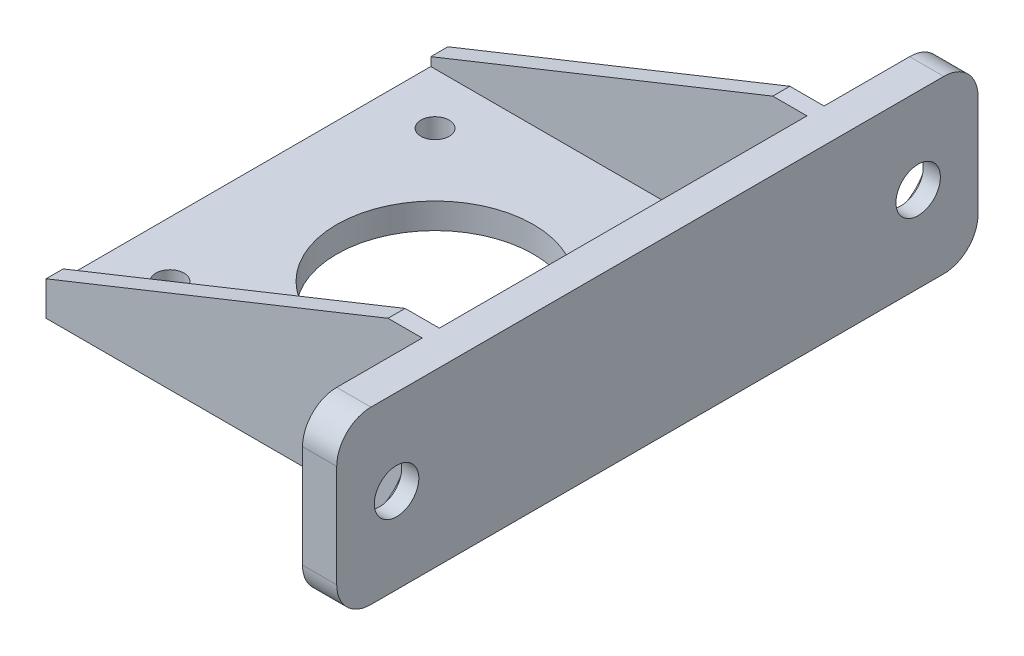
ISO-10303-21;
HEADER;
FILE_DESCRIPTION(('STEP AP214'),'2;1');
FILE_NAME('part.step','',(''),(''),'','','');
FILE_SCHEMA(('AUTOMOTIVE_DESIGN { 1 0 10303 214 1 1 1 1 }'));
ENDSEC;
DATA;
#1=APPLICATION_CONTEXT('core data for automotive mechanical design processes');
#2=APPLICATION_PROTOCOL_DEFINITION('international standard','automotive_design',2000,#1);
#3=PRODUCT_CONTEXT('',#1,'mechanical');
#4=PRODUCT('Part','Part','',(#3));
#5=PRODUCT_RELATED_PRODUCT_CATEGORY('part','',(#4));
#6=PRODUCT_DEFINITION_FORMATION('','',#4);
#7=PRODUCT_DEFINITION_CONTEXT('part definition',#1,'design');
#8=PRODUCT_DEFINITION('design','',#6,#7);
#9=PRODUCT_DEFINITION_SHAPE('','',#8);
#10=(LENGTH_UNIT() NAMED_UNIT(*) SI_UNIT(.MILLI.,.METRE.));
#11=(NAMED_UNIT(*) PLANE_ANGLE_UNIT() SI_UNIT($,.RADIAN.));
#12=(NAMED_UNIT(*) SI_UNIT($,.STERADIAN.) SOLID_ANGLE_UNIT());
#13=UNCERTAINTY_MEASURE_WITH_UNIT(LENGTH_MEASURE(1.E-05),#10,'distance_accuracy_value','');
#14=(GEOMETRIC_REPRESENTATION_CONTEXT(3) GLOBAL_UNCERTAINTY_ASSIGNED_CONTEXT((#13)) GLOBAL_UNIT_ASSIGNED_CONTEXT((#10,
#11,#12)) REPRESENTATION_CONTEXT('',''));
#15=CARTESIAN_POINT('',(0.,0.,0.));
#16=DIRECTION('',(0.,0.,1.));
#17=DIRECTION('',(1.,0.,0.));
#18=AXIS2_PLACEMENT_3D('',#15,#16,#17);
#19=CARTESIAN_POINT('',(-67.498,120.,233.));
#20=DIRECTION('',(-1.,0.,0.));
#21=DIRECTION('',(0.,0.,1.));
#22=AXIS2_PLACEMENT_3D('',#19,#20,#21);
#23=CYLINDRICAL_SURFACE('',#22,2.6);
#24=CARTESIAN_POINT('',(-67.5,120.,233.));
#25=DIRECTION('',(-1.,0.,0.));
#26=DIRECTION('',(0.,0.,1.));
#27=AXIS2_PLACEMENT_3D('',#24,#25,#26);
#28=CIRCLE('',#27,2.6);
#29=CARTESIAN_POINT('',(-67.5,120.,235.6));
#30=VERTEX_POINT('',#29);
#31=EDGE_CURVE('E219',#30,#30,#28,.F.);
#32=ORIENTED_EDGE('',*,*,#31,.T.);
#33=EDGE_LOOP('',(#32));
#34=FACE_BOUND('',#33,.T.);
#35=CARTESIAN_POINT('',(-69.5,120.,233.));
#36=DIRECTION('',(-1.,0.,0.));
#37=DIRECTION('',(0.,0.,1.));
#38=AXIS2_PLACEMENT_3D('',#35,#36,#37);
#39=CIRCLE('',#38,2.6);
#40=CARTESIAN_POINT('',(-69.5,120.,235.6));
#41=VERTEX_POINT('',#40);
#42=EDGE_CURVE('E587',#41,#41,#39,.T.);
#43=ORIENTED_EDGE('',*,*,#42,.T.);
#44=EDGE_LOOP('',(#43));
#45=FACE_BOUND('',#44,.T.);
#46=ADVANCED_FACE('F16',(#34,#45),#23,.F.);
#47=CARTESIAN_POINT('',(-67.498,120.,294.));
#48=DIRECTION('',(-1.,0.,0.));
#49=DIRECTION('',(0.,0.,1.));
#50=AXIS2_PLACEMENT_3D('',#47,#48,#49);
#51=CYLINDRICAL_SURFACE('',#50,2.6);
#52=CARTESIAN_POINT('',(-67.5,120.,294.));
#53=DIRECTION('',(-1.,0.,0.));
#54=DIRECTION('',(0.,0.,1.));
#55=AXIS2_PLACEMENT_3D('',#52,#53,#54);
#56=CIRCLE('',#55,2.6);
#57=CARTESIAN_POINT('',(-67.5,120.,296.6));
#58=VERTEX_POINT('',#57);
#59=EDGE_CURVE('E212',#58,#58,#56,.F.);
#60=ORIENTED_EDGE('',*,*,#59,.T.);
#61=EDGE_LOOP('',(#60));
#62=FACE_BOUND('',#61,.T.);
#63=CARTESIAN_POINT('',(-69.5,120.,294.));
#64=DIRECTION('',(-1.,0.,0.));
#65=DIRECTION('',(0.,0.,1.));
#66=AXIS2_PLACEMENT_3D('',#63,#64,#65);
#67=CIRCLE('',#66,2.6);
#68=CARTESIAN_POINT('',(-69.5,120.,296.6));
#69=VERTEX_POINT('',#68);
#70=EDGE_CURVE('E572',#69,#69,#67,.T.);
#71=ORIENTED_EDGE('',*,*,#70,.T.);
#72=EDGE_LOOP('',(#71));
#73=FACE_BOUND('',#72,.T.);
#74=ADVANCED_FACE('F485',(#62,#73),#51,.F.);
#75=CARTESIAN_POINT('',(-71.5,120.,170.));
#76=DIRECTION('',(-1.,0.,0.));
#77=DIRECTION('',(0.,-1.,0.));
#78=AXIS2_PLACEMENT_3D('',#75,#76,#77);
#79=PLANE('',#78);
#80=DIRECTION('',(0.,0.,-1.));
#81=VECTOR('',#80,1.);
#82=CARTESIAN_POINT('',(-71.5,130.,320.));
#83=LINE('',#82,#81);
#84=CARTESIAN_POINT('',(-71.5,130.,285.));
#85=VERTEX_POINT('',#84);
#86=CARTESIAN_POINT('',(-71.5,130.,242.));
#87=VERTEX_POINT('',#86);
#88=EDGE_CURVE('E202',#85,#87,#83,.T.);
#89=ORIENTED_EDGE('',*,*,#88,.T.);
#90=DIRECTION('',(0.,-1.,0.));
#91=VECTOR('',#90,1.);
#92=CARTESIAN_POINT('',(-71.5,130.002,242.));
#93=LINE('',#92,#91);
#94=CARTESIAN_POINT('',(-71.5,113.,242.));
#95=VERTEX_POINT('',#94);
#96=EDGE_CURVE('E199',#87,#95,#93,.T.);
#97=ORIENTED_EDGE('',*,*,#96,.T.);
#98=DIRECTION('',(0.,0.,-1.));
#99=VECTOR('',#98,1.);
#100=CARTESIAN_POINT('',(-71.5,113.,320.));
#101=LINE('',#100,#99);
#102=CARTESIAN_POINT('',(-71.5,113.,285.));
#103=VERTEX_POINT('',#102);
#104=EDGE_CURVE('E183',#103,#95,#101,.T.);
#105=ORIENTED_EDGE('',*,*,#104,.F.);
#106=DIRECTION('',(0.,-1.,0.));
#107=VECTOR('',#106,1.);
#108=CARTESIAN_POINT('',(-71.5,130.002,285.));
#109=LINE('',#108,#107);
#110=EDGE_CURVE('E232',#85,#103,#109,.T.);
#111=ORIENTED_EDGE('',*,*,#110,.F.);
#112=EDGE_LOOP('',(#89,#97,#105,#111));
#113=FACE_BOUND('',#112,.T.);
#114=ADVANCED_FACE('F200',(#113),#79,.T.);
#115=CARTESIAN_POINT('',(-91.5,113.,263.5));
#116=DIRECTION('',(0.,-1.,0.));
#117=DIRECTION('',(1.,0.,0.));
#118=AXIS2_PLACEMENT_3D('',#115,#116,#117);
#119=PLANE('',#118);
#120=CARTESIAN_POINT('',(-93.5,113.,263.5));
#121=DIRECTION('',(0.,-1.,0.));
#122=DIRECTION('',(0.,0.,-1.));
#123=AXIS2_PLACEMENT_3D('',#120,#121,#122);
#124=CIRCLE('',#123,11.5);
#125=CARTESIAN_POINT('',(-93.5,113.,252.));
#126=VERTEX_POINT('',#125);
#127=EDGE_CURVE('E251',#126,#126,#124,.F.);
#128=ORIENTED_EDGE('',*,*,#127,.F.);
#129=EDGE_LOOP('',(#128));
#130=FACE_BOUND('',#129,.T.);
#131=CARTESIAN_POINT('',(-109.,113.,279.));
#132=DIRECTION('',(0.,-1.,0.));
#133=DIRECTION('',(0.,0.,-1.));
#134=AXIS2_PLACEMENT_3D('',#131,#132,#133);
#135=CIRCLE('',#134,1.65);
#136=CARTESIAN_POINT('',(-109.,113.,277.35));
#137=VERTEX_POINT('',#136);
#138=EDGE_CURVE('E252',#137,#137,#135,.F.);
#139=ORIENTED_EDGE('',*,*,#138,.F.);
#140=EDGE_LOOP('',(#139));
#141=FACE_BOUND('',#140,.T.);
#142=CARTESIAN_POINT('',(-78.,113.,279.));
#143=DIRECTION('',(0.,-1.,0.));
#144=DIRECTION('',(0.,0.,-1.));
#145=AXIS2_PLACEMENT_3D('',#142,#143,#144);
#146=CIRCLE('',#145,1.65);
#147=CARTESIAN_POINT('',(-78.,113.,277.35));
#148=VERTEX_POINT('',#147);
#149=EDGE_CURVE('E260',#148,#148,#146,.F.);
#150=ORIENTED_EDGE('',*,*,#149,.F.);
#151=EDGE_LOOP('',(#150));
#152=FACE_BOUND('',#151,.T.);
#153=CARTESIAN_POINT('',(-78.,113.,248.));
#154=DIRECTION('',(0.,-1.,0.));
#155=DIRECTION('',(0.,0.,-1.));
#156=AXIS2_PLACEMENT_3D('',#153,#154,#155);
#157=CIRCLE('',#156,1.65);
#158=CARTESIAN_POINT('',(-78.,113.,246.35));
#159=VERTEX_POINT('',#158);
#160=EDGE_CURVE('E268',#159,#159,#157,.F.);
#161=ORIENTED_EDGE('',*,*,#160,.F.);
#162=EDGE_LOOP('',(#161));
#163=FACE_BOUND('',#162,.T.);
#164=CARTESIAN_POINT('',(-109.,113.,248.));
#165=DIRECTION('',(0.,-1.,0.));
#166=DIRECTION('',(0.,0.,-1.));
#167=AXIS2_PLACEMENT_3D('',#164,#165,#166);
#168=CIRCLE('',#167,1.65);
#169=CARTESIAN_POINT('',(-109.,113.,246.35));
#170=VERTEX_POINT('',#169);
#171=EDGE_CURVE('E243',#170,#170,#168,.F.);
#172=ORIENTED_EDGE('',*,*,#171,.F.);
#173=EDGE_LOOP('',(#172));
#174=FACE_BOUND('',#173,.T.);
#175=DIRECTION('',(1.,0.,0.));
#176=VECTOR('',#175,1.);
#177=CARTESIAN_POINT('',(-93.5,113.,242.));
#178=LINE('',#177,#176);
#179=CARTESIAN_POINT('',(-115.5,113.,242.));
#180=VERTEX_POINT('',#179);
#181=EDGE_CURVE('E188',#180,#95,#178,.T.);
#182=ORIENTED_EDGE('',*,*,#181,.F.);
#183=DIRECTION('',(0.,0.,-1.));
#184=VECTOR('',#183,1.);
#185=CARTESIAN_POINT('',(-115.5,113.,263.5));
#186=LINE('',#185,#184);
#187=CARTESIAN_POINT('',(-115.5,113.,285.));
#188=VERTEX_POINT('',#187);
#189=EDGE_CURVE('E195',#188,#180,#186,.T.);
#190=ORIENTED_EDGE('',*,*,#189,.F.);
#191=DIRECTION('',(1.,0.,0.));
#192=VECTOR('',#191,1.);
#193=CARTESIAN_POINT('',(-93.5,113.,285.));
#194=LINE('',#193,#192);
#195=EDGE_CURVE('E191',#188,#103,#194,.T.);
#196=ORIENTED_EDGE('',*,*,#195,.T.);
#197=ORIENTED_EDGE('',*,*,#104,.T.);
#198=EDGE_LOOP('',(#182,#190,#196,#197));
#199=FACE_BOUND('',#198,.T.);
#200=ADVANCED_FACE('F185',(#130,#141,#152,#163,#174,#199),#119,.F.);
#201=CARTESIAN_POINT('',(-71.5,120.,294.));
#202=DIRECTION('',(-1.,0.,0.));
#203=DIRECTION('',(0.,0.,1.));
#204=AXIS2_PLACEMENT_3D('',#201,#202,#203);
#205=CIRCLE('',#204,5.25);
#206=CARTESIAN_POINT('',(-71.5,120.,299.25));
#207=VERTEX_POINT('',#206);
#208=EDGE_CURVE('E568',#207,#207,#205,.T.);
#209=ORIENTED_EDGE('',*,*,#208,.F.);
#210=EDGE_LOOP('',(#209));
#211=FACE_BOUND('',#210,.T.);
#212=DIRECTION('',(0.,-1.,0.));
#213=VECTOR('',#212,1.);
#214=CARTESIAN_POINT('',(-71.5,120.,301.));
#215=LINE('',#214,#213);
#216=CARTESIAN_POINT('',(-71.5,126.,301.));
#217=VERTEX_POINT('',#216);
#218=CARTESIAN_POINT('',(-71.5,114.,301.));
#219=VERTEX_POINT('',#218);
#220=EDGE_CURVE('E313',#217,#219,#215,.T.);
#221=ORIENTED_EDGE('',*,*,#220,.F.);
#222=CARTESIAN_POINT('',(-71.5,126.,297.));
#223=DIRECTION('',(-1.,0.,0.));
#224=DIRECTION('',(0.,0.,1.));
#225=AXIS2_PLACEMENT_3D('',#222,#223,#224);
#226=CIRCLE('',#225,4.);
#227=CARTESIAN_POINT('',(-71.5,130.,297.));
#228=VERTEX_POINT('',#227);
#229=EDGE_CURVE('E397',#217,#228,#226,.T.);
#230=ORIENTED_EDGE('',*,*,#229,.T.);
#231=CARTESIAN_POINT('',(-71.5,130.,287.));
#232=VERTEX_POINT('',#231);
#233=EDGE_CURVE('E319',#228,#232,#83,.T.);
#234=ORIENTED_EDGE('',*,*,#233,.T.);
#235=DIRECTION('',(0.,-1.,0.));
#236=VECTOR('',#235,1.);
#237=CARTESIAN_POINT('',(-71.5,113.,287.));
#238=LINE('',#237,#236);
#239=CARTESIAN_POINT('',(-71.5,110.,287.));
#240=VERTEX_POINT('',#239);
#241=EDGE_CURVE('E308',#232,#240,#238,.T.);
#242=ORIENTED_EDGE('',*,*,#241,.T.);
#243=DIRECTION('',(0.,0.,-1.));
#244=VECTOR('',#243,1.);
#245=CARTESIAN_POINT('',(-71.5,110.,320.));
#246=LINE('',#245,#244);
#247=CARTESIAN_POINT('',(-71.5,110.,297.));
#248=VERTEX_POINT('',#247);
#249=EDGE_CURVE('E323',#248,#240,#246,.T.);
#250=ORIENTED_EDGE('',*,*,#249,.F.);
#251=CARTESIAN_POINT('',(-71.5,114.,297.));
#252=DIRECTION('',(-1.,0.,0.));
#253=DIRECTION('',(0.,0.,1.));
#254=AXIS2_PLACEMENT_3D('',#251,#252,#253);
#255=CIRCLE('',#254,4.);
#256=EDGE_CURVE('E394',#248,#219,#255,.T.);
#257=ORIENTED_EDGE('',*,*,#256,.T.);
#258=EDGE_LOOP('',(#221,#230,#234,#242,#250,#257));
#259=FACE_BOUND('',#258,.T.);
#260=ADVANCED_FACE('F456',(#211,#259),#79,.T.);
#261=CARTESIAN_POINT('',(-71.5,120.,301.));
#262=DIRECTION('',(0.,0.,1.));
#263=DIRECTION('',(1.,0.,0.));
#264=AXIS2_PLACEMENT_3D('',#261,#262,#263);
#265=PLANE('',#264);
#266=DIRECTION('',(0.,-1.,0.));
#267=VECTOR('',#266,1.);
#268=CARTESIAN_POINT('',(-67.5,120.,301.));
#269=LINE('',#268,#267);
#270=CARTESIAN_POINT('',(-67.5,126.,301.));
#271=VERTEX_POINT('',#270);
#272=CARTESIAN_POINT('',(-67.5,114.,301.));
#273=VERTEX_POINT('',#272);
#274=EDGE_CURVE('E312',#271,#273,#269,.T.);
#275=ORIENTED_EDGE('',*,*,#274,.F.);
#276=DIRECTION('',(1.,0.,0.));
#277=VECTOR('',#276,1.);
#278=CARTESIAN_POINT('',(-71.5,126.,301.));
#279=LINE('',#278,#277);
#280=EDGE_CURVE('E391',#271,#217,#279,.F.);
#281=ORIENTED_EDGE('',*,*,#280,.T.);
#282=ORIENTED_EDGE('',*,*,#220,.T.);
#283=DIRECTION('',(1.,0.,0.));
#284=VECTOR('',#283,1.);
#285=CARTESIAN_POINT('',(-71.5,114.,301.));
#286=LINE('',#285,#284);
#287=EDGE_CURVE('E387',#219,#273,#286,.T.);
#288=ORIENTED_EDGE('',*,*,#287,.T.);
#289=EDGE_LOOP('',(#275,#281,#282,#288));
#290=FACE_BOUND('',#289,.T.);
#291=ADVANCED_FACE('F446',(#290),#265,.T.);
#292=CARTESIAN_POINT('',(-71.5,130.,320.));
#293=DIRECTION('',(0.,-1.,0.));
#294=DIRECTION('',(0.,0.,-1.));
#295=AXIS2_PLACEMENT_3D('',#292,#293,#294);
#296=PLANE('',#295);
#297=ORIENTED_EDGE('',*,*,#233,.F.);
#298=DIRECTION('',(1.,0.,0.));
#299=VECTOR('',#298,1.);
#300=CARTESIAN_POINT('',(-67.5,130.,297.));
#301=LINE('',#300,#299);
#302=CARTESIAN_POINT('',(-67.5,130.,297.));
#303=VERTEX_POINT('',#302);
#304=EDGE_CURVE('E371',#228,#303,#301,.T.);
#305=ORIENTED_EDGE('',*,*,#304,.T.);
#306=DIRECTION('',(0.,0.,-1.));
#307=VECTOR('',#306,1.);
#308=CARTESIAN_POINT('',(-67.5,130.,320.));
#309=LINE('',#308,#307);
#310=CARTESIAN_POINT('',(-67.5,130.,230.));
#311=VERTEX_POINT('',#310);
#312=EDGE_CURVE('E333',#303,#311,#309,.T.);
#313=ORIENTED_EDGE('',*,*,#312,.T.);
#314=DIRECTION('',(1.,0.,0.));
#315=VECTOR('',#314,1.);
#316=CARTESIAN_POINT('',(-71.5,130.,230.));
#317=LINE('',#316,#315);
#318=CARTESIAN_POINT('',(-71.5,130.,230.));
#319=VERTEX_POINT('',#318);
#320=EDGE_CURVE('E368',#311,#319,#317,.F.);
#321=ORIENTED_EDGE('',*,*,#320,.T.);
#322=CARTESIAN_POINT('',(-71.5,130.,240.));
#323=VERTEX_POINT('',#322);
#324=EDGE_CURVE('E317',#323,#319,#83,.T.);
#325=ORIENTED_EDGE('',*,*,#324,.F.);
#326=DIRECTION('',(1.,0.,0.));
#327=VECTOR('',#326,1.);
#328=CARTESIAN_POINT('',(-93.5,130.,240.));
#329=LINE('',#328,#327);
#330=CARTESIAN_POINT('',(-75.5,130.,240.));
#331=VERTEX_POINT('',#330);
#332=EDGE_CURVE('E225',#331,#323,#329,.T.);
#333=ORIENTED_EDGE('',*,*,#332,.F.);
#334=DIRECTION('',(0.,0.,1.));
#335=VECTOR('',#334,1.);
#336=CARTESIAN_POINT('',(-75.5,130.,242.));
#337=LINE('',#336,#335);
#338=CARTESIAN_POINT('',(-75.5,130.,242.));
#339=VERTEX_POINT('',#338);
#340=EDGE_CURVE('E346',#331,#339,#337,.T.);
#341=ORIENTED_EDGE('',*,*,#340,.T.);
#342=DIRECTION('',(-1.,0.,0.));
#343=VECTOR('',#342,1.);
#344=CARTESIAN_POINT('',(-93.5,130.,242.));
#345=LINE('',#344,#343);
#346=EDGE_CURVE('E228',#87,#339,#345,.T.);
#347=ORIENTED_EDGE('',*,*,#346,.F.);
#348=ORIENTED_EDGE('',*,*,#88,.F.);
#349=DIRECTION('',(-1.,0.,0.));
#350=VECTOR('',#349,1.);
#351=CARTESIAN_POINT('',(-93.5,130.,285.));
#352=LINE('',#351,#350);
#353=CARTESIAN_POINT('',(-75.5,130.,285.));
#354=VERTEX_POINT('',#353);
#355=EDGE_CURVE('E236',#85,#354,#352,.T.);
#356=ORIENTED_EDGE('',*,*,#355,.T.);
#357=DIRECTION('',(0.,0.,1.));
#358=VECTOR('',#357,1.);
#359=CARTESIAN_POINT('',(-75.5,130.,287.));
#360=LINE('',#359,#358);
#361=CARTESIAN_POINT('',(-75.5,130.,287.));
#362=VERTEX_POINT('',#361);
#363=EDGE_CURVE('E329',#354,#362,#360,.T.);
#364=ORIENTED_EDGE('',*,*,#363,.T.);
#365=DIRECTION('',(1.,0.,0.));
#366=VECTOR('',#365,1.);
#367=CARTESIAN_POINT('',(-93.5,130.,287.));
#368=LINE('',#367,#366);
#369=EDGE_CURVE('E239',#362,#232,#368,.T.);
#370=ORIENTED_EDGE('',*,*,#369,.T.);
#371=EDGE_LOOP('',(#297,#305,#313,#321,#325,#333,#341,#347,#348,#356,#364,#370));
#372=FACE_BOUND('',#371,.T.);
#373=ADVANCED_FACE('F437',(#372),#296,.F.);
#374=CARTESIAN_POINT('',(-71.5,120.,226.));
#375=DIRECTION('',(0.,0.,1.));
#376=DIRECTION('',(1.,0.,0.));
#377=AXIS2_PLACEMENT_3D('',#374,#375,#376);
#378=PLANE('',#377);
#379=DIRECTION('',(0.,-1.,0.));
#380=VECTOR('',#379,1.);
#381=CARTESIAN_POINT('',(-71.5,120.,226.));
#382=LINE('',#381,#380);
#383=CARTESIAN_POINT('',(-71.5,126.,226.));
#384=VERTEX_POINT('',#383);
#385=CARTESIAN_POINT('',(-71.5,114.,226.));
#386=VERTEX_POINT('',#385);
#387=EDGE_CURVE('E326',#384,#386,#382,.T.);
#388=ORIENTED_EDGE('',*,*,#387,.F.);
#389=DIRECTION('',(1.,0.,0.));
#390=VECTOR('',#389,1.);
#391=CARTESIAN_POINT('',(-71.5,126.,226.));
#392=LINE('',#391,#390);
#393=CARTESIAN_POINT('',(-67.5,126.,226.));
#394=VERTEX_POINT('',#393);
#395=EDGE_CURVE('E409',#384,#394,#392,.T.);
#396=ORIENTED_EDGE('',*,*,#395,.T.);
#397=DIRECTION('',(0.,-1.,0.));
#398=VECTOR('',#397,1.);
#399=CARTESIAN_POINT('',(-67.5,120.,226.));
#400=LINE('',#399,#398);
#401=CARTESIAN_POINT('',(-67.5,114.,226.));
#402=VERTEX_POINT('',#401);
#403=EDGE_CURVE('E318',#394,#402,#400,.T.);
#404=ORIENTED_EDGE('',*,*,#403,.T.);
#405=DIRECTION('',(1.,0.,0.));
#406=VECTOR('',#405,1.);
#407=CARTESIAN_POINT('',(-71.5,114.,226.));
#408=LINE('',#407,#406);
#409=EDGE_CURVE('E37',#402,#386,#408,.F.);
#410=ORIENTED_EDGE('',*,*,#409,.T.);
#411=EDGE_LOOP('',(#388,#396,#404,#410));
#412=FACE_BOUND('',#411,.T.);
#413=ADVANCED_FACE('F430',(#412),#378,.F.);
#414=CARTESIAN_POINT('',(-71.5,110.,320.));
#415=DIRECTION('',(0.,-1.,0.));
#416=DIRECTION('',(0.,0.,-1.));
#417=AXIS2_PLACEMENT_3D('',#414,#415,#416);
#418=PLANE('',#417);
#419=CARTESIAN_POINT('',(-109.,110.,248.));
#420=DIRECTION('',(0.,-1.,0.));
#421=DIRECTION('',(0.,0.,-1.));
#422=AXIS2_PLACEMENT_3D('',#419,#420,#421);
#423=CIRCLE('',#422,1.65);
#424=CARTESIAN_POINT('',(-109.,110.,246.35));
#425=VERTEX_POINT('',#424);
#426=EDGE_CURVE('E272',#425,#425,#423,.T.);
#427=ORIENTED_EDGE('',*,*,#426,.F.);
#428=EDGE_LOOP('',(#427));
#429=FACE_BOUND('',#428,.T.);
#430=CARTESIAN_POINT('',(-78.,110.,248.));
#431=DIRECTION('',(0.,-1.,0.));
#432=DIRECTION('',(0.,0.,-1.));
#433=AXIS2_PLACEMENT_3D('',#430,#431,#432);
#434=CIRCLE('',#433,1.65);
#435=CARTESIAN_POINT('',(-78.,110.,246.35));
#436=VERTEX_POINT('',#435);
#437=EDGE_CURVE('E264',#436,#436,#434,.T.);
#438=ORIENTED_EDGE('',*,*,#437,.F.);
#439=EDGE_LOOP('',(#438));
#440=FACE_BOUND('',#439,.T.);
#441=CARTESIAN_POINT('',(-78.,110.,279.));
#442=DIRECTION('',(0.,-1.,0.));
#443=DIRECTION('',(0.,0.,-1.));
#444=AXIS2_PLACEMENT_3D('',#441,#442,#443);
#445=CIRCLE('',#444,1.65);
#446=CARTESIAN_POINT('',(-78.,110.,277.35));
#447=VERTEX_POINT('',#446);
#448=EDGE_CURVE('E256',#447,#447,#445,.T.);
#449=ORIENTED_EDGE('',*,*,#448,.F.);
#450=EDGE_LOOP('',(#449));
#451=FACE_BOUND('',#450,.T.);
#452=CARTESIAN_POINT('',(-109.,110.,279.));
#453=DIRECTION('',(0.,-1.,0.));
#454=DIRECTION('',(0.,0.,-1.));
#455=AXIS2_PLACEMENT_3D('',#452,#453,#454);
#456=CIRCLE('',#455,1.65);
#457=CARTESIAN_POINT('',(-109.,110.,277.35));
#458=VERTEX_POINT('',#457);
#459=EDGE_CURVE('E247',#458,#458,#456,.T.);
#460=ORIENTED_EDGE('',*,*,#459,.F.);
#461=EDGE_LOOP('',(#460));
#462=FACE_BOUND('',#461,.T.);
#463=CARTESIAN_POINT('',(-93.5,110.,263.5));
#464=DIRECTION('',(0.,-1.,0.));
#465=DIRECTION('',(0.,0.,-1.));
#466=AXIS2_PLACEMENT_3D('',#463,#464,#465);
#467=CIRCLE('',#466,11.5);
#468=CARTESIAN_POINT('',(-93.5,110.,252.));
#469=VERTEX_POINT('',#468);
#470=EDGE_CURVE('E279',#469,#469,#467,.T.);
#471=ORIENTED_EDGE('',*,*,#470,.F.);
#472=EDGE_LOOP('',(#471));
#473=FACE_BOUND('',#472,.T.);
#474=DIRECTION('',(0.,0.,-1.));
#475=VECTOR('',#474,1.);
#476=CARTESIAN_POINT('',(-67.5,110.,320.));
#477=LINE('',#476,#475);
#478=CARTESIAN_POINT('',(-67.5,110.,297.));
#479=VERTEX_POINT('',#478);
#480=CARTESIAN_POINT('',(-67.5,110.,230.));
#481=VERTEX_POINT('',#480);
#482=EDGE_CURVE('E337',#479,#481,#477,.T.);
#483=ORIENTED_EDGE('',*,*,#482,.F.);
#484=DIRECTION('',(1.,0.,0.));
#485=VECTOR('',#484,1.);
#486=CARTESIAN_POINT('',(-71.5,110.,297.));
#487=LINE('',#486,#485);
#488=EDGE_CURVE('E404',#479,#248,#487,.F.);
#489=ORIENTED_EDGE('',*,*,#488,.T.);
#490=ORIENTED_EDGE('',*,*,#249,.T.);
#491=DIRECTION('',(-1.,0.,0.));
#492=VECTOR('',#491,1.);
#493=CARTESIAN_POINT('',(-93.5,110.,287.));
#494=LINE('',#493,#492);
#495=CARTESIAN_POINT('',(-115.5,110.,287.));
#496=VERTEX_POINT('',#495);
#497=EDGE_CURVE('E283',#240,#496,#494,.T.);
#498=ORIENTED_EDGE('',*,*,#497,.T.);
#499=DIRECTION('',(0.,0.,-1.));
#500=VECTOR('',#499,1.);
#501=CARTESIAN_POINT('',(-115.5,110.,263.5));
#502=LINE('',#501,#500);
#503=CARTESIAN_POINT('',(-115.5,110.,240.));
#504=VERTEX_POINT('',#503);
#505=EDGE_CURVE('E293',#496,#504,#502,.T.);
#506=ORIENTED_EDGE('',*,*,#505,.T.);
#507=DIRECTION('',(-1.,0.,0.));
#508=VECTOR('',#507,1.);
#509=CARTESIAN_POINT('',(-93.5,110.,240.));
#510=LINE('',#509,#508);
#511=CARTESIAN_POINT('',(-71.5,110.,240.));
#512=VERTEX_POINT('',#511);
#513=EDGE_CURVE('E196',#512,#504,#510,.T.);
#514=ORIENTED_EDGE('',*,*,#513,.F.);
#515=CARTESIAN_POINT('',(-71.5,110.,230.));
#516=VERTEX_POINT('',#515);
#517=EDGE_CURVE('E322',#512,#516,#246,.T.);
#518=ORIENTED_EDGE('',*,*,#517,.T.);
#519=DIRECTION('',(1.,0.,0.));
#520=VECTOR('',#519,1.);
#521=CARTESIAN_POINT('',(-67.5,110.,230.));
#522=LINE('',#521,#520);
#523=EDGE_CURVE('E400',#516,#481,#522,.T.);
#524=ORIENTED_EDGE('',*,*,#523,.T.);
#525=EDGE_LOOP('',(#483,#489,#490,#498,#506,#514,#518,#524));
#526=FACE_BOUND('',#525,.T.);
#527=ADVANCED_FACE('F424',(#429,#440,#451,#462,#473,#526),#418,.T.);
#528=CARTESIAN_POINT('',(-71.5,120.,233.));
#529=DIRECTION('',(-1.,0.,0.));
#530=DIRECTION('',(0.,0.,1.));
#531=AXIS2_PLACEMENT_3D('',#528,#529,#530);
#532=CIRCLE('',#531,5.25);
#533=CARTESIAN_POINT('',(-71.5,120.,238.25));
#534=VERTEX_POINT('',#533);
#535=EDGE_CURVE('E583',#534,#534,#532,.T.);
#536=ORIENTED_EDGE('',*,*,#535,.F.);
#537=EDGE_LOOP('',(#536));
#538=FACE_BOUND('',#537,.T.);
#539=ORIENTED_EDGE('',*,*,#324,.T.);
#540=CARTESIAN_POINT('',(-71.5,126.,230.));
#541=DIRECTION('',(-1.,0.,0.));
#542=DIRECTION('',(0.,0.,1.));
#543=AXIS2_PLACEMENT_3D('',#540,#541,#542);
#544=CIRCLE('',#543,4.);
#545=EDGE_CURVE('E10',#319,#384,#544,.T.);
#546=ORIENTED_EDGE('',*,*,#545,.T.);
#547=ORIENTED_EDGE('',*,*,#387,.T.);
#548=CARTESIAN_POINT('',(-71.5,114.,230.));
#549=DIRECTION('',(-1.,0.,0.));
#550=DIRECTION('',(0.,0.,1.));
#551=AXIS2_PLACEMENT_3D('',#548,#549,#550);
#552=CIRCLE('',#551,4.);
#553=EDGE_CURVE('E25',#386,#516,#552,.T.);
#554=ORIENTED_EDGE('',*,*,#553,.T.);
#555=ORIENTED_EDGE('',*,*,#517,.F.);
#556=DIRECTION('',(0.,-1.,0.));
#557=VECTOR('',#556,1.);
#558=CARTESIAN_POINT('',(-71.5,113.,240.));
#559=LINE('',#558,#557);
#560=EDGE_CURVE('E289',#323,#512,#559,.T.);
#561=ORIENTED_EDGE('',*,*,#560,.F.);
#562=EDGE_LOOP('',(#539,#546,#547,#554,#555,#561));
#563=FACE_BOUND('',#562,.T.);
#564=ADVANCED_FACE('F417',(#538,#563),#79,.T.);
#565=CARTESIAN_POINT('',(-67.5,120.,170.));
#566=DIRECTION('',(-1.,0.,0.));
#567=DIRECTION('',(0.,-1.,0.));
#568=AXIS2_PLACEMENT_3D('',#565,#566,#567);
#569=PLANE('',#568);
#570=ORIENTED_EDGE('',*,*,#59,.F.);
#571=EDGE_LOOP('',(#570));
#572=FACE_BOUND('',#571,.T.);
#573=ORIENTED_EDGE('',*,*,#31,.F.);
#574=EDGE_LOOP('',(#573));
#575=FACE_BOUND('',#574,.T.);
#576=ORIENTED_EDGE('',*,*,#312,.F.);
#577=CARTESIAN_POINT('',(-67.5,126.,297.));
#578=DIRECTION('',(-1.,0.,0.));
#579=DIRECTION('',(0.,0.,1.));
#580=AXIS2_PLACEMENT_3D('',#577,#578,#579);
#581=CIRCLE('',#580,4.);
#582=EDGE_CURVE('E384',#303,#271,#581,.F.);
#583=ORIENTED_EDGE('',*,*,#582,.T.);
#584=ORIENTED_EDGE('',*,*,#274,.T.);
#585=CARTESIAN_POINT('',(-67.5,114.,297.));
#586=DIRECTION('',(-1.,0.,0.));
#587=DIRECTION('',(0.,0.,1.));
#588=AXIS2_PLACEMENT_3D('',#585,#586,#587);
#589=CIRCLE('',#588,4.);
#590=EDGE_CURVE('E381',#273,#479,#589,.F.);
#591=ORIENTED_EDGE('',*,*,#590,.T.);
#592=ORIENTED_EDGE('',*,*,#482,.T.);
#593=CARTESIAN_POINT('',(-67.5,114.,230.));
#594=DIRECTION('',(-1.,0.,0.));
#595=DIRECTION('',(0.,0.,1.));
#596=AXIS2_PLACEMENT_3D('',#593,#594,#595);
#597=CIRCLE('',#596,4.);
#598=EDGE_CURVE('E375',#481,#402,#597,.F.);
#599=ORIENTED_EDGE('',*,*,#598,.T.);
#600=ORIENTED_EDGE('',*,*,#403,.F.);
#601=CARTESIAN_POINT('',(-67.5,126.,230.));
#602=DIRECTION('',(-1.,0.,0.));
#603=DIRECTION('',(0.,0.,1.));
#604=AXIS2_PLACEMENT_3D('',#601,#602,#603);
#605=CIRCLE('',#604,4.);
#606=EDGE_CURVE('E378',#394,#311,#605,.F.);
#607=ORIENTED_EDGE('',*,*,#606,.T.);
#608=EDGE_LOOP('',(#576,#583,#584,#591,#592,#599,#600,#607));
#609=FACE_BOUND('',#608,.T.);
#610=ADVANCED_FACE('F429',(#572,#575,#609),#569,.F.);
#611=CARTESIAN_POINT('',(-93.5,113.,287.));
#612=DIRECTION('',(0.,0.,1.));
#613=DIRECTION('',(1.,0.,0.));
#614=AXIS2_PLACEMENT_3D('',#611,#612,#613);
#615=PLANE('',#614);
#616=ORIENTED_EDGE('',*,*,#369,.F.);
#617=DIRECTION('',(-0.928476690885259,-0.371390676354104,0.));
#618=VECTOR('',#617,1.);
#619=CARTESIAN_POINT('',(-96.8793103448276,121.448275862069,287.));
#620=LINE('',#619,#618);
#621=CARTESIAN_POINT('',(-115.5,114.,287.));
#622=VERTEX_POINT('',#621);
#623=EDGE_CURVE('E362',#362,#622,#620,.T.);
#624=ORIENTED_EDGE('',*,*,#623,.T.);
#625=DIRECTION('',(0.,-1.,0.));
#626=VECTOR('',#625,1.);
#627=CARTESIAN_POINT('',(-115.5,113.,287.));
#628=LINE('',#627,#626);
#629=EDGE_CURVE('E305',#622,#496,#628,.T.);
#630=ORIENTED_EDGE('',*,*,#629,.T.);
#631=ORIENTED_EDGE('',*,*,#497,.F.);
#632=ORIENTED_EDGE('',*,*,#241,.F.);
#633=EDGE_LOOP('',(#616,#624,#630,#631,#632));
#634=FACE_BOUND('',#633,.T.);
#635=ADVANCED_FACE('F460',(#634),#615,.T.);
#636=CARTESIAN_POINT('',(-115.5,113.,263.5));
#637=DIRECTION('',(-1.,0.,0.));
#638=DIRECTION('',(0.,0.,1.));
#639=AXIS2_PLACEMENT_3D('',#636,#637,#638);
#640=PLANE('',#639);
#641=DIRECTION('',(0.,-1.,0.));
#642=VECTOR('',#641,1.);
#643=CARTESIAN_POINT('',(-115.5,130.002,242.));
#644=LINE('',#643,#642);
#645=CARTESIAN_POINT('',(-115.5,114.,242.));
#646=VERTEX_POINT('',#645);
#647=EDGE_CURVE('E207',#646,#180,#644,.T.);
#648=ORIENTED_EDGE('',*,*,#647,.F.);
#649=DIRECTION('',(0.,0.,-1.));
#650=VECTOR('',#649,1.);
#651=CARTESIAN_POINT('',(-115.5,114.,240.));
#652=LINE('',#651,#650);
#653=CARTESIAN_POINT('',(-115.5,114.,240.));
#654=VERTEX_POINT('',#653);
#655=EDGE_CURVE('E356',#646,#654,#652,.T.);
#656=ORIENTED_EDGE('',*,*,#655,.T.);
#657=DIRECTION('',(0.,-1.,0.));
#658=VECTOR('',#657,1.);
#659=CARTESIAN_POINT('',(-115.5,113.,240.));
#660=LINE('',#659,#658);
#661=EDGE_CURVE('E302',#654,#504,#660,.T.);
#662=ORIENTED_EDGE('',*,*,#661,.T.);
#663=ORIENTED_EDGE('',*,*,#505,.F.);
#664=ORIENTED_EDGE('',*,*,#629,.F.);
#665=DIRECTION('',(0.,0.,-1.));
#666=VECTOR('',#665,1.);
#667=CARTESIAN_POINT('',(-115.5,114.,285.));
#668=LINE('',#667,#666);
#669=CARTESIAN_POINT('',(-115.5,114.,285.));
#670=VERTEX_POINT('',#669);
#671=EDGE_CURVE('E353',#622,#670,#668,.T.);
#672=ORIENTED_EDGE('',*,*,#671,.T.);
#673=DIRECTION('',(0.,-1.,0.));
#674=VECTOR('',#673,1.);
#675=CARTESIAN_POINT('',(-115.5,130.002,285.));
#676=LINE('',#675,#674);
#677=EDGE_CURVE('E233',#670,#188,#676,.T.);
#678=ORIENTED_EDGE('',*,*,#677,.T.);
#679=ORIENTED_EDGE('',*,*,#189,.T.);
#680=EDGE_LOOP('',(#648,#656,#662,#663,#664,#672,#678,#679));
#681=FACE_BOUND('',#680,.T.);
#682=ADVANCED_FACE('F464',(#681),#640,.T.);
#683=CARTESIAN_POINT('',(-93.5,113.,240.));
#684=DIRECTION('',(0.,0.,1.));
#685=DIRECTION('',(1.,0.,0.));
#686=AXIS2_PLACEMENT_3D('',#683,#684,#685);
#687=PLANE('',#686);
#688=ORIENTED_EDGE('',*,*,#661,.F.);
#689=DIRECTION('',(0.928476690885259,0.371390676354104,0.));
#690=VECTOR('',#689,1.);
#691=CARTESIAN_POINT('',(-75.5,130.,240.));
#692=LINE('',#691,#690);
#693=EDGE_CURVE('E359',#654,#331,#692,.T.);
#694=ORIENTED_EDGE('',*,*,#693,.T.);
#695=ORIENTED_EDGE('',*,*,#332,.T.);
#696=ORIENTED_EDGE('',*,*,#560,.T.);
#697=ORIENTED_EDGE('',*,*,#513,.T.);
#698=EDGE_LOOP('',(#688,#694,#695,#696,#697));
#699=FACE_BOUND('',#698,.T.);
#700=ADVANCED_FACE('F470',(#699),#687,.F.);
#701=CARTESIAN_POINT('',(-93.5,130.002,263.5));
#702=DIRECTION('',(0.,-1.,0.));
#703=DIRECTION('',(0.,0.,-1.));
#704=AXIS2_PLACEMENT_3D('',#701,#702,#703);
#705=CYLINDRICAL_SURFACE('',#704,11.5);
#706=ORIENTED_EDGE('',*,*,#127,.T.);
#707=EDGE_LOOP('',(#706));
#708=FACE_BOUND('',#707,.T.);
#709=ORIENTED_EDGE('',*,*,#470,.T.);
#710=EDGE_LOOP('',(#709));
#711=FACE_BOUND('',#710,.T.);
#712=ADVANCED_FACE('F555',(#708,#711),#705,.F.);
#713=CARTESIAN_POINT('',(-109.,130.002,279.));
#714=DIRECTION('',(0.,-1.,0.));
#715=DIRECTION('',(0.,0.,-1.));
#716=AXIS2_PLACEMENT_3D('',#713,#714,#715);
#717=CYLINDRICAL_SURFACE('',#716,1.65);
#718=ORIENTED_EDGE('',*,*,#138,.T.);
#719=EDGE_LOOP('',(#718));
#720=FACE_BOUND('',#719,.T.);
#721=ORIENTED_EDGE('',*,*,#459,.T.);
#722=EDGE_LOOP('',(#721));
#723=FACE_BOUND('',#722,.T.);
#724=ADVANCED_FACE('F646',(#720,#723),#717,.F.);
#725=CARTESIAN_POINT('',(-78.,130.002,279.));
#726=DIRECTION('',(0.,-1.,0.));
#727=DIRECTION('',(0.,0.,-1.));
#728=AXIS2_PLACEMENT_3D('',#725,#726,#727);
#729=CYLINDRICAL_SURFACE('',#728,1.65);
#730=ORIENTED_EDGE('',*,*,#149,.T.);
#731=EDGE_LOOP('',(#730));
#732=FACE_BOUND('',#731,.T.);
#733=ORIENTED_EDGE('',*,*,#448,.T.);
#734=EDGE_LOOP('',(#733));
#735=FACE_BOUND('',#734,.T.);
#736=ADVANCED_FACE('F649',(#732,#735),#729,.F.);
#737=CARTESIAN_POINT('',(-78.,130.002,248.));
#738=DIRECTION('',(0.,-1.,0.));
#739=DIRECTION('',(0.,0.,-1.));
#740=AXIS2_PLACEMENT_3D('',#737,#738,#739);
#741=CYLINDRICAL_SURFACE('',#740,1.65);
#742=ORIENTED_EDGE('',*,*,#160,.T.);
#743=EDGE_LOOP('',(#742));
#744=FACE_BOUND('',#743,.T.);
#745=ORIENTED_EDGE('',*,*,#437,.T.);
#746=EDGE_LOOP('',(#745));
#747=FACE_BOUND('',#746,.T.);
#748=ADVANCED_FACE('F653',(#744,#747),#741,.F.);
#749=CARTESIAN_POINT('',(-109.,130.002,248.));
#750=DIRECTION('',(0.,-1.,0.));
#751=DIRECTION('',(0.,0.,-1.));
#752=AXIS2_PLACEMENT_3D('',#749,#750,#751);
#753=CYLINDRICAL_SURFACE('',#752,1.65);
#754=ORIENTED_EDGE('',*,*,#171,.T.);
#755=EDGE_LOOP('',(#754));
#756=FACE_BOUND('',#755,.T.);
#757=ORIENTED_EDGE('',*,*,#426,.T.);
#758=EDGE_LOOP('',(#757));
#759=FACE_BOUND('',#758,.T.);
#760=ADVANCED_FACE('F536',(#756,#759),#753,.F.);
#761=CARTESIAN_POINT('',(-93.5,130.002,285.));
#762=DIRECTION('',(0.,0.,-1.));
#763=DIRECTION('',(-1.,0.,0.));
#764=AXIS2_PLACEMENT_3D('',#761,#762,#763);
#765=PLANE('',#764);
#766=ORIENTED_EDGE('',*,*,#677,.F.);
#767=DIRECTION('',(0.928476690885259,0.371390676354104,0.));
#768=VECTOR('',#767,1.);
#769=CARTESIAN_POINT('',(-91.0165517241379,123.793379310345,285.));
#770=LINE('',#769,#768);
#771=EDGE_CURVE('E365',#670,#354,#770,.T.);
#772=ORIENTED_EDGE('',*,*,#771,.T.);
#773=ORIENTED_EDGE('',*,*,#355,.F.);
#774=ORIENTED_EDGE('',*,*,#110,.T.);
#775=ORIENTED_EDGE('',*,*,#195,.F.);
#776=EDGE_LOOP('',(#766,#772,#773,#774,#775));
#777=FACE_BOUND('',#776,.T.);
#778=ADVANCED_FACE('F532',(#777),#765,.T.);
#779=CARTESIAN_POINT('',(-93.5,130.002,242.));
#780=DIRECTION('',(0.,0.,-1.));
#781=DIRECTION('',(-1.,0.,0.));
#782=AXIS2_PLACEMENT_3D('',#779,#780,#781);
#783=PLANE('',#782);
#784=ORIENTED_EDGE('',*,*,#346,.T.);
#785=DIRECTION('',(-0.928476690885259,-0.371390676354104,0.));
#786=VECTOR('',#785,1.);
#787=CARTESIAN_POINT('',(-75.5,130.,242.));
#788=LINE('',#787,#786);
#789=EDGE_CURVE('E350',#339,#646,#788,.T.);
#790=ORIENTED_EDGE('',*,*,#789,.T.);
#791=ORIENTED_EDGE('',*,*,#647,.T.);
#792=ORIENTED_EDGE('',*,*,#181,.T.);
#793=ORIENTED_EDGE('',*,*,#96,.F.);
#794=EDGE_LOOP('',(#784,#790,#791,#792,#793));
#795=FACE_BOUND('',#794,.T.);
#796=ADVANCED_FACE('F209',(#795),#783,.F.);
#797=CARTESIAN_POINT('',(-75.5,130.,320.));
#798=DIRECTION('',(-0.371390676354104,0.928476690885259,0.));
#799=DIRECTION('',(0.,0.,-1.));
#800=AXIS2_PLACEMENT_3D('',#797,#798,#799);
#801=PLANE('',#800);
#802=ORIENTED_EDGE('',*,*,#693,.F.);
#803=ORIENTED_EDGE('',*,*,#655,.F.);
#804=ORIENTED_EDGE('',*,*,#789,.F.);
#805=ORIENTED_EDGE('',*,*,#340,.F.);
#806=EDGE_LOOP('',(#802,#803,#804,#805));
#807=FACE_BOUND('',#806,.T.);
#808=ADVANCED_FACE('F520',(#807),#801,.T.);
#809=CARTESIAN_POINT('',(-75.5,130.,320.));
#810=DIRECTION('',(-0.371390676354104,0.928476690885259,0.));
#811=DIRECTION('',(0.,0.,-1.));
#812=AXIS2_PLACEMENT_3D('',#809,#810,#811);
#813=PLANE('',#812);
#814=ORIENTED_EDGE('',*,*,#771,.F.);
#815=ORIENTED_EDGE('',*,*,#671,.F.);
#816=ORIENTED_EDGE('',*,*,#623,.F.);
#817=ORIENTED_EDGE('',*,*,#363,.F.);
#818=EDGE_LOOP('',(#814,#815,#816,#817));
#819=FACE_BOUND('',#818,.T.);
#820=ADVANCED_FACE('F515',(#819),#813,.T.);
#821=CARTESIAN_POINT('',(-69.5,120.,294.));
#822=DIRECTION('',(-1.,0.,0.));
#823=DIRECTION('',(0.,0.,1.));
#824=AXIS2_PLACEMENT_3D('',#821,#822,#823);
#825=CYLINDRICAL_SURFACE('',#824,5.25);
#826=CARTESIAN_POINT('',(-69.5,120.,294.));
#827=DIRECTION('',(-1.,0.,0.));
#828=DIRECTION('',(0.,0.,1.));
#829=AXIS2_PLACEMENT_3D('',#826,#827,#828);
#830=CIRCLE('',#829,5.25);
#831=CARTESIAN_POINT('',(-69.5,120.,299.25));
#832=VERTEX_POINT('',#831);
#833=EDGE_CURVE('E567',#832,#832,#830,.T.);
#834=ORIENTED_EDGE('',*,*,#833,.F.);
#835=EDGE_LOOP('',(#834));
#836=FACE_BOUND('',#835,.T.);
#837=ORIENTED_EDGE('',*,*,#208,.T.);
#838=EDGE_LOOP('',(#837));
#839=FACE_BOUND('',#838,.T.);
#840=ADVANCED_FACE('F519',(#836,#839),#825,.F.);
#841=CARTESIAN_POINT('',(-69.5,120.,264.375));
#842=DIRECTION('',(-1.,0.,0.));
#843=DIRECTION('',(0.,-1.,0.));
#844=AXIS2_PLACEMENT_3D('',#841,#842,#843);
#845=PLANE('',#844);
#846=ORIENTED_EDGE('',*,*,#70,.F.);
#847=EDGE_LOOP('',(#846));
#848=FACE_BOUND('',#847,.T.);
#849=ORIENTED_EDGE('',*,*,#833,.T.);
#850=EDGE_LOOP('',(#849));
#851=FACE_BOUND('',#850,.T.);
#852=ADVANCED_FACE('F599',(#848,#851),#845,.T.);
#853=CARTESIAN_POINT('',(-69.5,120.,233.));
#854=DIRECTION('',(-1.,0.,0.));
#855=DIRECTION('',(0.,0.,1.));
#856=AXIS2_PLACEMENT_3D('',#853,#854,#855);
#857=CYLINDRICAL_SURFACE('',#856,5.25);
#858=CARTESIAN_POINT('',(-69.5,120.,233.));
#859=DIRECTION('',(-1.,0.,0.));
#860=DIRECTION('',(0.,0.,1.));
#861=AXIS2_PLACEMENT_3D('',#858,#859,#860);
#862=CIRCLE('',#861,5.25);
#863=CARTESIAN_POINT('',(-69.5,120.,238.25));
#864=VERTEX_POINT('',#863);
#865=EDGE_CURVE('E573',#864,#864,#862,.T.);
#866=ORIENTED_EDGE('',*,*,#865,.F.);
#867=EDGE_LOOP('',(#866));
#868=FACE_BOUND('',#867,.T.);
#869=ORIENTED_EDGE('',*,*,#535,.T.);
#870=EDGE_LOOP('',(#869));
#871=FACE_BOUND('',#870,.T.);
#872=ADVANCED_FACE('F606',(#868,#871),#857,.F.);
#873=CARTESIAN_POINT('',(-69.5,120.,264.375));
#874=DIRECTION('',(-1.,0.,0.));
#875=DIRECTION('',(0.,-1.,0.));
#876=AXIS2_PLACEMENT_3D('',#873,#874,#875);
#877=PLANE('',#876);
#878=ORIENTED_EDGE('',*,*,#42,.F.);
#879=EDGE_LOOP('',(#878));
#880=FACE_BOUND('',#879,.T.);
#881=ORIENTED_EDGE('',*,*,#865,.T.);
#882=EDGE_LOOP('',(#881));
#883=FACE_BOUND('',#882,.T.);
#884=ADVANCED_FACE('F613',(#880,#883),#877,.T.);
#885=CARTESIAN_POINT('',(-71.5,126.,297.));
#886=DIRECTION('',(-1.,0.,0.));
#887=DIRECTION('',(0.,0.,1.));
#888=AXIS2_PLACEMENT_3D('',#885,#886,#887);
#889=CYLINDRICAL_SURFACE('',#888,4.);
#890=ORIENTED_EDGE('',*,*,#229,.F.);
#891=ORIENTED_EDGE('',*,*,#280,.F.);
#892=ORIENTED_EDGE('',*,*,#582,.F.);
#893=ORIENTED_EDGE('',*,*,#304,.F.);
#894=EDGE_LOOP('',(#890,#891,#892,#893));
#895=FACE_BOUND('',#894,.T.);
#896=ADVANCED_FACE('F442',(#895),#889,.T.);
#897=CARTESIAN_POINT('',(-71.5,114.,297.));
#898=DIRECTION('',(1.,0.,0.));
#899=DIRECTION('',(0.,0.,-1.));
#900=AXIS2_PLACEMENT_3D('',#897,#898,#899);
#901=CYLINDRICAL_SURFACE('',#900,4.);
#902=ORIENTED_EDGE('',*,*,#256,.F.);
#903=ORIENTED_EDGE('',*,*,#488,.F.);
#904=ORIENTED_EDGE('',*,*,#590,.F.);
#905=ORIENTED_EDGE('',*,*,#287,.F.);
#906=EDGE_LOOP('',(#902,#903,#904,#905));
#907=FACE_BOUND('',#906,.T.);
#908=ADVANCED_FACE('F451',(#907),#901,.T.);
#909=CARTESIAN_POINT('',(-71.5,126.,230.));
#910=DIRECTION('',(1.,0.,0.));
#911=DIRECTION('',(0.,0.,-1.));
#912=AXIS2_PLACEMENT_3D('',#909,#910,#911);
#913=CYLINDRICAL_SURFACE('',#912,4.);
#914=ORIENTED_EDGE('',*,*,#545,.F.);
#915=ORIENTED_EDGE('',*,*,#320,.F.);
#916=ORIENTED_EDGE('',*,*,#606,.F.);
#917=ORIENTED_EDGE('',*,*,#395,.F.);
#918=EDGE_LOOP('',(#914,#915,#916,#917));
#919=FACE_BOUND('',#918,.T.);
#920=ADVANCED_FACE('F433',(#919),#913,.T.);
#921=CARTESIAN_POINT('',(-71.5,114.,230.));
#922=DIRECTION('',(-1.,0.,0.));
#923=DIRECTION('',(0.,0.,1.));
#924=AXIS2_PLACEMENT_3D('',#921,#922,#923);
#925=CYLINDRICAL_SURFACE('',#924,4.);
#926=ORIENTED_EDGE('',*,*,#553,.F.);
#927=ORIENTED_EDGE('',*,*,#409,.F.);
#928=ORIENTED_EDGE('',*,*,#598,.F.);
#929=ORIENTED_EDGE('',*,*,#523,.F.);
#930=EDGE_LOOP('',(#926,#927,#928,#929));
#931=FACE_BOUND('',#930,.T.);
#932=ADVANCED_FACE('F18',(#931),#925,.T.);
#933=CLOSED_SHELL('',(#46,#74,#114,#200,#260,#291,#373,#413,#527,#564,#610,#635,#682,#700,#712,
#724,#736,#748,#760,#778,#796,#808,#820,#840,#852,#872,#884,#896,#908,#920,#932));
#934=MANIFOLD_SOLID_BREP('B1',#933);
#935=ADVANCED_BREP_SHAPE_REPRESENTATION('',(#18,#934),#14);
#936=SHAPE_DEFINITION_REPRESENTATION(#9,#935);
ENDSEC;
END-ISO-10303-21;
